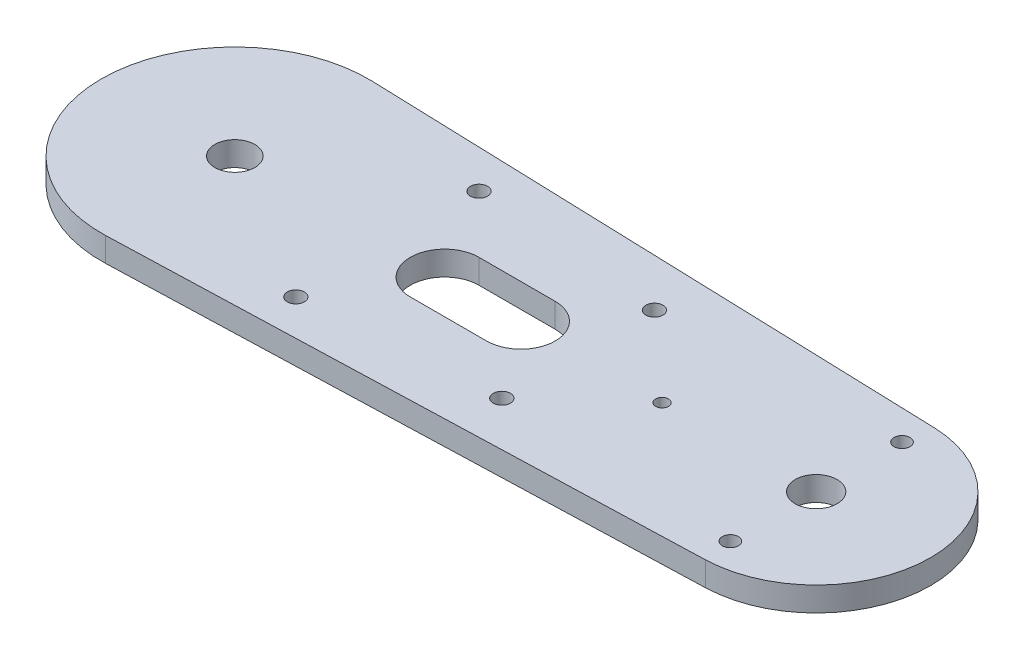
ISO-10303-21;
HEADER;
FILE_DESCRIPTION(('STEP AP214'),'2;1');
FILE_NAME('part.step','',(''),(''),'','','');
FILE_SCHEMA(('AUTOMOTIVE_DESIGN { 1 0 10303 214 1 1 1 1 }'));
ENDSEC;
DATA;
#1=APPLICATION_CONTEXT('core data for automotive mechanical design processes');
#2=APPLICATION_PROTOCOL_DEFINITION('international standard','automotive_design',2000,#1);
#3=PRODUCT_CONTEXT('',#1,'mechanical');
#4=PRODUCT('Part','Part','',(#3));
#5=PRODUCT_RELATED_PRODUCT_CATEGORY('part','',(#4));
#6=PRODUCT_DEFINITION_FORMATION('','',#4);
#7=PRODUCT_DEFINITION_CONTEXT('part definition',#1,'design');
#8=PRODUCT_DEFINITION('design','',#6,#7);
#9=PRODUCT_DEFINITION_SHAPE('','',#8);
#10=(LENGTH_UNIT() NAMED_UNIT(*) SI_UNIT(.MILLI.,.METRE.));
#11=(NAMED_UNIT(*) PLANE_ANGLE_UNIT() SI_UNIT($,.RADIAN.));
#12=(NAMED_UNIT(*) SI_UNIT($,.STERADIAN.) SOLID_ANGLE_UNIT());
#13=UNCERTAINTY_MEASURE_WITH_UNIT(LENGTH_MEASURE(1.E-05),#10,'distance_accuracy_value','');
#14=(GEOMETRIC_REPRESENTATION_CONTEXT(3) GLOBAL_UNCERTAINTY_ASSIGNED_CONTEXT((#13)) GLOBAL_UNIT_ASSIGNED_CONTEXT((#10,
#11,#12)) REPRESENTATION_CONTEXT('',''));
#15=CARTESIAN_POINT('',(0.,0.,0.));
#16=DIRECTION('',(0.,0.,1.));
#17=DIRECTION('',(1.,0.,0.));
#18=AXIS2_PLACEMENT_3D('',#15,#16,#17);
#19=CARTESIAN_POINT('',(0.,-4.,0.));
#20=DIRECTION('',(0.,1.,0.));
#21=DIRECTION('',(0.,0.,1.));
#22=AXIS2_PLACEMENT_3D('',#19,#20,#21);
#23=PLANE('',#22);
#24=CARTESIAN_POINT('',(112.,-4.,171.45));
#25=DIRECTION('',(0.,1.,0.));
#26=DIRECTION('',(0.,0.,1.));
#27=AXIS2_PLACEMENT_3D('',#24,#25,#26);
#28=CIRCLE('',#27,1.69999999999999);
#29=CARTESIAN_POINT('',(112.,-4.,173.15));
#30=VERTEX_POINT('',#29);
#31=EDGE_CURVE('E380',#30,#30,#28,.T.);
#32=ORIENTED_EDGE('',*,*,#31,.F.);
#33=EDGE_LOOP('',(#32));
#34=FACE_BOUND('',#33,.T.);
#35=CARTESIAN_POINT('',(0.,-4.,171.45));
#36=DIRECTION('',(0.,1.,0.));
#37=DIRECTION('',(0.,0.,1.));
#38=AXIS2_PLACEMENT_3D('',#35,#36,#37);
#39=CIRCLE('',#38,5.25);
#40=CARTESIAN_POINT('',(0.,-4.,176.7));
#41=VERTEX_POINT('',#40);
#42=EDGE_CURVE('E383',#41,#41,#39,.T.);
#43=ORIENTED_EDGE('',*,*,#42,.F.);
#44=EDGE_LOOP('',(#43));
#45=FACE_BOUND('',#44,.T.);
#46=CARTESIAN_POINT('',(152.4,-4.,171.45));
#47=DIRECTION('',(0.,1.,0.));
#48=DIRECTION('',(0.,0.,1.));
#49=AXIS2_PLACEMENT_3D('',#46,#47,#48);
#50=CIRCLE('',#49,5.50000000000001);
#51=CARTESIAN_POINT('',(152.4,-4.,176.95));
#52=VERTEX_POINT('',#51);
#53=EDGE_CURVE('E395',#52,#52,#50,.T.);
#54=ORIENTED_EDGE('',*,*,#53,.F.);
#55=EDGE_LOOP('',(#54));
#56=FACE_BOUND('',#55,.T.);
#57=CARTESIAN_POINT('',(152.4,-4.,193.95));
#58=DIRECTION('',(0.,1.,0.));
#59=DIRECTION('',(0.,0.,1.));
#60=AXIS2_PLACEMENT_3D('',#57,#58,#59);
#61=CIRCLE('',#60,2.09999999999999);
#62=CARTESIAN_POINT('',(152.4,-4.,196.05));
#63=VERTEX_POINT('',#62);
#64=EDGE_CURVE('E402',#63,#63,#61,.T.);
#65=ORIENTED_EDGE('',*,*,#64,.F.);
#66=EDGE_LOOP('',(#65));
#67=FACE_BOUND('',#66,.T.);
#68=CARTESIAN_POINT('',(152.4,-4.,148.95));
#69=DIRECTION('',(0.,1.,0.));
#70=DIRECTION('',(0.,0.,1.));
#71=AXIS2_PLACEMENT_3D('',#68,#69,#70);
#72=CIRCLE('',#71,2.09999999999999);
#73=CARTESIAN_POINT('',(152.4,-4.,151.05));
#74=VERTEX_POINT('',#73);
#75=EDGE_CURVE('E385',#74,#74,#72,.T.);
#76=ORIENTED_EDGE('',*,*,#75,.F.);
#77=EDGE_LOOP('',(#76));
#78=FACE_BOUND('',#77,.T.);
#79=CARTESIAN_POINT('',(40.,-4.,147.45));
#80=DIRECTION('',(0.,1.,0.));
#81=DIRECTION('',(0.,0.,1.));
#82=AXIS2_PLACEMENT_3D('',#79,#80,#81);
#83=CIRCLE('',#82,2.25);
#84=CARTESIAN_POINT('',(40.,-4.,149.7));
#85=VERTEX_POINT('',#84);
#86=EDGE_CURVE('E416',#85,#85,#83,.T.);
#87=ORIENTED_EDGE('',*,*,#86,.F.);
#88=EDGE_LOOP('',(#87));
#89=FACE_BOUND('',#88,.T.);
#90=CARTESIAN_POINT('',(90.,-4.,191.45));
#91=DIRECTION('',(0.,1.,0.));
#92=DIRECTION('',(0.,0.,1.));
#93=AXIS2_PLACEMENT_3D('',#90,#91,#92);
#94=CIRCLE('',#93,2.25);
#95=CARTESIAN_POINT('',(90.,-4.,193.7));
#96=VERTEX_POINT('',#95);
#97=EDGE_CURVE('E412',#96,#96,#94,.T.);
#98=ORIENTED_EDGE('',*,*,#97,.F.);
#99=EDGE_LOOP('',(#98));
#100=FACE_BOUND('',#99,.T.);
#101=CARTESIAN_POINT('',(90.,-4.,151.45));
#102=DIRECTION('',(0.,1.,0.));
#103=DIRECTION('',(0.,0.,1.));
#104=AXIS2_PLACEMENT_3D('',#101,#102,#103);
#105=CIRCLE('',#104,2.25);
#106=CARTESIAN_POINT('',(90.,-4.,153.7));
#107=VERTEX_POINT('',#106);
#108=EDGE_CURVE('E387',#107,#107,#105,.T.);
#109=ORIENTED_EDGE('',*,*,#108,.F.);
#110=EDGE_LOOP('',(#109));
#111=FACE_BOUND('',#110,.T.);
#112=CARTESIAN_POINT('',(40.,-4.,195.45));
#113=DIRECTION('',(0.,1.,0.));
#114=DIRECTION('',(0.,0.,1.));
#115=AXIS2_PLACEMENT_3D('',#112,#113,#114);
#116=CIRCLE('',#115,2.25);
#117=CARTESIAN_POINT('',(40.,-4.,197.7));
#118=VERTEX_POINT('',#117);
#119=EDGE_CURVE('E137',#118,#118,#116,.T.);
#120=ORIENTED_EDGE('',*,*,#119,.F.);
#121=EDGE_LOOP('',(#120));
#122=FACE_BOUND('',#121,.T.);
#123=DIRECTION('',(0.999461659573957,0.,-0.0328083989501311));
#124=VECTOR('',#123,1.);
#125=CARTESIAN_POINT('',(1.14829396325459,-4.,206.431158085088));
#126=LINE('',#125,#124);
#127=CARTESIAN_POINT('',(1.14829396325459,-4.,206.431158085088));
#128=VERTEX_POINT('',#127);
#129=CARTESIAN_POINT('',(153.384251968504,-4.,201.433849787219));
#130=VERTEX_POINT('',#129);
#131=EDGE_CURVE('E159',#128,#130,#126,.T.);
#132=ORIENTED_EDGE('',*,*,#131,.T.);
#133=CARTESIAN_POINT('',(152.4,-4.,171.45));
#134=DIRECTION('',(0.,1.,0.));
#135=DIRECTION('',(0.,0.,1.));
#136=AXIS2_PLACEMENT_3D('',#133,#134,#135);
#137=CIRCLE('',#136,30.);
#138=CARTESIAN_POINT('',(153.384251968504,-4.,141.466150212781));
#139=VERTEX_POINT('',#138);
#140=EDGE_CURVE('E146',#130,#139,#137,.T.);
#141=ORIENTED_EDGE('',*,*,#140,.T.);
#142=DIRECTION('',(-0.999461659573957,0.,-0.0328083989501311));
#143=VECTOR('',#142,1.);
#144=CARTESIAN_POINT('',(153.384251968504,-4.,141.466150212781));
#145=LINE('',#144,#143);
#146=CARTESIAN_POINT('',(1.14829396325459,-4.,136.468841914911));
#147=VERTEX_POINT('',#146);
#148=EDGE_CURVE('E158',#139,#147,#145,.T.);
#149=ORIENTED_EDGE('',*,*,#148,.T.);
#150=CARTESIAN_POINT('',(0.,-4.,171.45));
#151=DIRECTION('',(0.,1.,0.));
#152=DIRECTION('',(0.,0.,1.));
#153=AXIS2_PLACEMENT_3D('',#150,#151,#152);
#154=CIRCLE('',#153,35.);
#155=EDGE_CURVE('E151',#147,#128,#154,.T.);
#156=ORIENTED_EDGE('',*,*,#155,.T.);
#157=EDGE_LOOP('',(#132,#141,#149,#156));
#158=FACE_BOUND('',#157,.T.);
#159=DIRECTION('',(1.,0.,0.));
#160=VECTOR('',#159,1.);
#161=CARTESIAN_POINT('',(75.,-4.,180.45));
#162=LINE('',#161,#160);
#163=CARTESIAN_POINT('',(55.,-4.,180.45));
#164=VERTEX_POINT('',#163);
#165=CARTESIAN_POINT('',(75.,-4.,180.45));
#166=VERTEX_POINT('',#165);
#167=EDGE_CURVE('E116',#164,#166,#162,.T.);
#168=ORIENTED_EDGE('',*,*,#167,.F.);
#169=CARTESIAN_POINT('',(55.,-4.,171.45));
#170=DIRECTION('',(0.,1.,0.));
#171=DIRECTION('',(0.,0.,-1.));
#172=AXIS2_PLACEMENT_3D('',#169,#170,#171);
#173=CIRCLE('',#172,9.00000000000001);
#174=CARTESIAN_POINT('',(55.,-4.,162.45));
#175=VERTEX_POINT('',#174);
#176=EDGE_CURVE('E108',#175,#164,#173,.T.);
#177=ORIENTED_EDGE('',*,*,#176,.F.);
#178=DIRECTION('',(-1.,0.,0.));
#179=VECTOR('',#178,1.);
#180=CARTESIAN_POINT('',(55.,-4.,162.45));
#181=LINE('',#180,#179);
#182=CARTESIAN_POINT('',(75.,-4.,162.45));
#183=VERTEX_POINT('',#182);
#184=EDGE_CURVE('E129',#183,#175,#181,.T.);
#185=ORIENTED_EDGE('',*,*,#184,.F.);
#186=CARTESIAN_POINT('',(75.,-4.,171.45));
#187=DIRECTION('',(0.,1.,0.));
#188=DIRECTION('',(0.,0.,-1.));
#189=AXIS2_PLACEMENT_3D('',#186,#187,#188);
#190=CIRCLE('',#189,9.00000000000001);
#191=EDGE_CURVE('E127',#166,#183,#190,.T.);
#192=ORIENTED_EDGE('',*,*,#191,.F.);
#193=EDGE_LOOP('',(#168,#177,#185,#192));
#194=FACE_BOUND('',#193,.T.);
#195=ADVANCED_FACE('F43',(#34,#45,#56,#67,#78,#89,#100,#111,#122,#158,#194),#23,.T.);
#196=CARTESIAN_POINT('',(0.,-10.35,0.));
#197=DIRECTION('',(0.,1.,0.));
#198=DIRECTION('',(0.,0.,1.));
#199=AXIS2_PLACEMENT_3D('',#196,#197,#198);
#200=PLANE('',#199);
#201=CARTESIAN_POINT('',(112.,-10.35,171.45));
#202=DIRECTION('',(0.,1.,0.));
#203=DIRECTION('',(0.,0.,1.));
#204=AXIS2_PLACEMENT_3D('',#201,#202,#203);
#205=CIRCLE('',#204,1.69999999999999);
#206=CARTESIAN_POINT('',(112.,-10.35,173.15));
#207=VERTEX_POINT('',#206);
#208=EDGE_CURVE('E379',#207,#207,#205,.T.);
#209=ORIENTED_EDGE('',*,*,#208,.T.);
#210=EDGE_LOOP('',(#209));
#211=FACE_BOUND('',#210,.T.);
#212=CARTESIAN_POINT('',(0.,-10.35,171.45));
#213=DIRECTION('',(0.,1.,0.));
#214=DIRECTION('',(0.,0.,1.));
#215=AXIS2_PLACEMENT_3D('',#212,#213,#214);
#216=CIRCLE('',#215,5.25);
#217=CARTESIAN_POINT('',(0.,-10.35,176.7));
#218=VERTEX_POINT('',#217);
#219=EDGE_CURVE('E388',#218,#218,#216,.T.);
#220=ORIENTED_EDGE('',*,*,#219,.T.);
#221=EDGE_LOOP('',(#220));
#222=FACE_BOUND('',#221,.T.);
#223=CARTESIAN_POINT('',(152.4,-10.35,171.45));
#224=DIRECTION('',(0.,1.,0.));
#225=DIRECTION('',(0.,0.,1.));
#226=AXIS2_PLACEMENT_3D('',#223,#224,#225);
#227=CIRCLE('',#226,5.50000000000001);
#228=CARTESIAN_POINT('',(152.4,-10.35,176.95));
#229=VERTEX_POINT('',#228);
#230=EDGE_CURVE('E392',#229,#229,#227,.T.);
#231=ORIENTED_EDGE('',*,*,#230,.T.);
#232=EDGE_LOOP('',(#231));
#233=FACE_BOUND('',#232,.T.);
#234=CARTESIAN_POINT('',(152.4,-10.35,193.95));
#235=DIRECTION('',(0.,1.,0.));
#236=DIRECTION('',(0.,0.,1.));
#237=AXIS2_PLACEMENT_3D('',#234,#235,#236);
#238=CIRCLE('',#237,2.09999999999999);
#239=CARTESIAN_POINT('',(152.4,-10.35,196.05));
#240=VERTEX_POINT('',#239);
#241=EDGE_CURVE('E400',#240,#240,#238,.T.);
#242=ORIENTED_EDGE('',*,*,#241,.T.);
#243=EDGE_LOOP('',(#242));
#244=FACE_BOUND('',#243,.T.);
#245=CARTESIAN_POINT('',(152.4,-10.35,148.95));
#246=DIRECTION('',(0.,1.,0.));
#247=DIRECTION('',(0.,0.,1.));
#248=AXIS2_PLACEMENT_3D('',#245,#246,#247);
#249=CIRCLE('',#248,2.09999999999999);
#250=CARTESIAN_POINT('',(152.4,-10.35,151.05));
#251=VERTEX_POINT('',#250);
#252=EDGE_CURVE('E404',#251,#251,#249,.T.);
#253=ORIENTED_EDGE('',*,*,#252,.T.);
#254=EDGE_LOOP('',(#253));
#255=FACE_BOUND('',#254,.T.);
#256=CARTESIAN_POINT('',(40.,-10.35,147.45));
#257=DIRECTION('',(0.,1.,0.));
#258=DIRECTION('',(0.,0.,1.));
#259=AXIS2_PLACEMENT_3D('',#256,#257,#258);
#260=CIRCLE('',#259,2.25);
#261=CARTESIAN_POINT('',(40.,-10.35,149.7));
#262=VERTEX_POINT('',#261);
#263=EDGE_CURVE('E415',#262,#262,#260,.T.);
#264=ORIENTED_EDGE('',*,*,#263,.T.);
#265=EDGE_LOOP('',(#264));
#266=FACE_BOUND('',#265,.T.);
#267=CARTESIAN_POINT('',(90.,-10.35,191.45));
#268=DIRECTION('',(0.,1.,0.));
#269=DIRECTION('',(0.,0.,1.));
#270=AXIS2_PLACEMENT_3D('',#267,#268,#269);
#271=CIRCLE('',#270,2.25);
#272=CARTESIAN_POINT('',(90.,-10.35,193.7));
#273=VERTEX_POINT('',#272);
#274=EDGE_CURVE('E422',#273,#273,#271,.T.);
#275=ORIENTED_EDGE('',*,*,#274,.T.);
#276=EDGE_LOOP('',(#275));
#277=FACE_BOUND('',#276,.T.);
#278=CARTESIAN_POINT('',(90.,-10.35,151.45));
#279=DIRECTION('',(0.,1.,0.));
#280=DIRECTION('',(0.,0.,1.));
#281=AXIS2_PLACEMENT_3D('',#278,#279,#280);
#282=CIRCLE('',#281,2.25);
#283=CARTESIAN_POINT('',(90.,-10.35,153.7));
#284=VERTEX_POINT('',#283);
#285=EDGE_CURVE('E408',#284,#284,#282,.T.);
#286=ORIENTED_EDGE('',*,*,#285,.T.);
#287=EDGE_LOOP('',(#286));
#288=FACE_BOUND('',#287,.T.);
#289=CARTESIAN_POINT('',(40.,-10.35,195.45));
#290=DIRECTION('',(0.,1.,0.));
#291=DIRECTION('',(0.,0.,1.));
#292=AXIS2_PLACEMENT_3D('',#289,#290,#291);
#293=CIRCLE('',#292,2.25);
#294=CARTESIAN_POINT('',(40.,-10.35,197.7));
#295=VERTEX_POINT('',#294);
#296=EDGE_CURVE('E420',#295,#295,#293,.T.);
#297=ORIENTED_EDGE('',*,*,#296,.T.);
#298=EDGE_LOOP('',(#297));
#299=FACE_BOUND('',#298,.T.);
#300=DIRECTION('',(-0.999461659573957,0.,-0.0328083989501311));
#301=VECTOR('',#300,1.);
#302=CARTESIAN_POINT('',(153.384251968504,-10.35,141.466150212781));
#303=LINE('',#302,#301);
#304=CARTESIAN_POINT('',(153.384251968504,-10.35,141.466150212781));
#305=VERTEX_POINT('',#304);
#306=CARTESIAN_POINT('',(1.14829396325459,-10.35,136.468841914911));
#307=VERTEX_POINT('',#306);
#308=EDGE_CURVE('E163',#305,#307,#303,.T.);
#309=ORIENTED_EDGE('',*,*,#308,.F.);
#310=CARTESIAN_POINT('',(152.4,-10.35,171.45));
#311=DIRECTION('',(0.,1.,0.));
#312=DIRECTION('',(0.,0.,1.));
#313=AXIS2_PLACEMENT_3D('',#310,#311,#312);
#314=CIRCLE('',#313,30.);
#315=CARTESIAN_POINT('',(153.384251968504,-10.35,201.433849787219));
#316=VERTEX_POINT('',#315);
#317=EDGE_CURVE('E121',#316,#305,#314,.T.);
#318=ORIENTED_EDGE('',*,*,#317,.F.);
#319=DIRECTION('',(0.999461659573957,0.,-0.0328083989501311));
#320=VECTOR('',#319,1.);
#321=CARTESIAN_POINT('',(1.14829396325459,-10.35,206.431158085088));
#322=LINE('',#321,#320);
#323=CARTESIAN_POINT('',(1.14829396325459,-10.35,206.431158085088));
#324=VERTEX_POINT('',#323);
#325=EDGE_CURVE('E153',#324,#316,#322,.T.);
#326=ORIENTED_EDGE('',*,*,#325,.F.);
#327=CARTESIAN_POINT('',(0.,-10.35,171.45));
#328=DIRECTION('',(0.,1.,0.));
#329=DIRECTION('',(0.,0.,1.));
#330=AXIS2_PLACEMENT_3D('',#327,#328,#329);
#331=CIRCLE('',#330,35.);
#332=EDGE_CURVE('E148',#307,#324,#331,.T.);
#333=ORIENTED_EDGE('',*,*,#332,.F.);
#334=EDGE_LOOP('',(#309,#318,#326,#333));
#335=FACE_BOUND('',#334,.T.);
#336=CARTESIAN_POINT('',(55.,-10.35,171.45));
#337=DIRECTION('',(0.,1.,0.));
#338=DIRECTION('',(0.,0.,-1.));
#339=AXIS2_PLACEMENT_3D('',#336,#337,#338);
#340=CIRCLE('',#339,9.00000000000001);
#341=CARTESIAN_POINT('',(55.,-10.35,162.45));
#342=VERTEX_POINT('',#341);
#343=CARTESIAN_POINT('',(55.,-10.35,180.45));
#344=VERTEX_POINT('',#343);
#345=EDGE_CURVE('E66',#342,#344,#340,.T.);
#346=ORIENTED_EDGE('',*,*,#345,.T.);
#347=DIRECTION('',(1.,0.,0.));
#348=VECTOR('',#347,1.);
#349=CARTESIAN_POINT('',(75.,-10.35,180.45));
#350=LINE('',#349,#348);
#351=CARTESIAN_POINT('',(75.,-10.35,180.45));
#352=VERTEX_POINT('',#351);
#353=EDGE_CURVE('E124',#344,#352,#350,.T.);
#354=ORIENTED_EDGE('',*,*,#353,.T.);
#355=CARTESIAN_POINT('',(75.,-10.35,171.45));
#356=DIRECTION('',(0.,1.,0.));
#357=DIRECTION('',(0.,0.,-1.));
#358=AXIS2_PLACEMENT_3D('',#355,#356,#357);
#359=CIRCLE('',#358,9.00000000000001);
#360=CARTESIAN_POINT('',(75.,-10.35,162.45));
#361=VERTEX_POINT('',#360);
#362=EDGE_CURVE('E140',#352,#361,#359,.T.);
#363=ORIENTED_EDGE('',*,*,#362,.T.);
#364=DIRECTION('',(-1.,0.,0.));
#365=VECTOR('',#364,1.);
#366=CARTESIAN_POINT('',(55.,-10.35,162.45));
#367=LINE('',#366,#365);
#368=EDGE_CURVE('E120',#361,#342,#367,.T.);
#369=ORIENTED_EDGE('',*,*,#368,.T.);
#370=EDGE_LOOP('',(#346,#354,#363,#369));
#371=FACE_BOUND('',#370,.T.);
#372=ADVANCED_FACE('F178',(#211,#222,#233,#244,#255,#266,#277,#288,#299,#335,#371),#200,.F.);
#373=CARTESIAN_POINT('',(1.14829396325459,-4.,206.431158085088));
#374=DIRECTION('',(-0.0328083989501311,0.,-0.999461659573957));
#375=DIRECTION('',(-0.999461659573957,0.,0.0328083989501311));
#376=AXIS2_PLACEMENT_3D('',#373,#374,#375);
#377=PLANE('',#376);
#378=ORIENTED_EDGE('',*,*,#325,.T.);
#379=DIRECTION('',(0.,-1.,0.));
#380=VECTOR('',#379,1.);
#381=CARTESIAN_POINT('',(153.384251968504,-4.,201.433849787219));
#382=LINE('',#381,#380);
#383=EDGE_CURVE('E51',#130,#316,#382,.T.);
#384=ORIENTED_EDGE('',*,*,#383,.F.);
#385=ORIENTED_EDGE('',*,*,#131,.F.);
#386=DIRECTION('',(0.,-1.,0.));
#387=VECTOR('',#386,1.);
#388=CARTESIAN_POINT('',(1.14829396325459,-4.,206.431158085088));
#389=LINE('',#388,#387);
#390=EDGE_CURVE('E11',#128,#324,#389,.T.);
#391=ORIENTED_EDGE('',*,*,#390,.T.);
#392=EDGE_LOOP('',(#378,#384,#385,#391));
#393=FACE_BOUND('',#392,.T.);
#394=ADVANCED_FACE('F44',(#393),#377,.F.);
#395=CARTESIAN_POINT('',(153.384251968504,-4.,141.466150212781));
#396=DIRECTION('',(-0.0328083989501311,0.,0.999461659573957));
#397=DIRECTION('',(0.999461659573957,0.,0.0328083989501311));
#398=AXIS2_PLACEMENT_3D('',#395,#396,#397);
#399=PLANE('',#398);
#400=ORIENTED_EDGE('',*,*,#308,.T.);
#401=DIRECTION('',(0.,-1.,0.));
#402=VECTOR('',#401,1.);
#403=CARTESIAN_POINT('',(1.14829396325459,-4.,136.468841914911));
#404=LINE('',#403,#402);
#405=EDGE_CURVE('E161',#147,#307,#404,.T.);
#406=ORIENTED_EDGE('',*,*,#405,.F.);
#407=ORIENTED_EDGE('',*,*,#148,.F.);
#408=DIRECTION('',(0.,-1.,0.));
#409=VECTOR('',#408,1.);
#410=CARTESIAN_POINT('',(153.384251968504,-4.,141.466150212781));
#411=LINE('',#410,#409);
#412=EDGE_CURVE('E169',#139,#305,#411,.T.);
#413=ORIENTED_EDGE('',*,*,#412,.T.);
#414=EDGE_LOOP('',(#400,#406,#407,#413));
#415=FACE_BOUND('',#414,.T.);
#416=ADVANCED_FACE('F189',(#415),#399,.F.);
#417=CARTESIAN_POINT('',(0.,-4.,171.45));
#418=DIRECTION('',(0.,-1.,0.));
#419=DIRECTION('',(0.,0.,-1.));
#420=AXIS2_PLACEMENT_3D('',#417,#418,#419);
#421=CYLINDRICAL_SURFACE('',#420,35.);
#422=ORIENTED_EDGE('',*,*,#332,.T.);
#423=ORIENTED_EDGE('',*,*,#390,.F.);
#424=ORIENTED_EDGE('',*,*,#155,.F.);
#425=ORIENTED_EDGE('',*,*,#405,.T.);
#426=EDGE_LOOP('',(#422,#423,#424,#425));
#427=FACE_BOUND('',#426,.T.);
#428=ADVANCED_FACE('F183',(#427),#421,.T.);
#429=CARTESIAN_POINT('',(152.4,-4.,171.45));
#430=DIRECTION('',(0.,-1.,0.));
#431=DIRECTION('',(0.,0.,-1.));
#432=AXIS2_PLACEMENT_3D('',#429,#430,#431);
#433=CYLINDRICAL_SURFACE('',#432,30.);
#434=ORIENTED_EDGE('',*,*,#140,.F.);
#435=ORIENTED_EDGE('',*,*,#383,.T.);
#436=ORIENTED_EDGE('',*,*,#317,.T.);
#437=ORIENTED_EDGE('',*,*,#412,.F.);
#438=EDGE_LOOP('',(#434,#435,#436,#437));
#439=FACE_BOUND('',#438,.T.);
#440=ADVANCED_FACE('F172',(#439),#433,.T.);
#441=CARTESIAN_POINT('',(55.,-4.,171.45));
#442=DIRECTION('',(0.,-1.,0.));
#443=DIRECTION('',(0.,0.,-1.));
#444=AXIS2_PLACEMENT_3D('',#441,#442,#443);
#445=CYLINDRICAL_SURFACE('',#444,9.00000000000001);
#446=ORIENTED_EDGE('',*,*,#345,.F.);
#447=DIRECTION('',(0.,-1.,0.));
#448=VECTOR('',#447,1.);
#449=CARTESIAN_POINT('',(55.,-4.,162.45));
#450=LINE('',#449,#448);
#451=EDGE_CURVE('E115',#175,#342,#450,.T.);
#452=ORIENTED_EDGE('',*,*,#451,.F.);
#453=ORIENTED_EDGE('',*,*,#176,.T.);
#454=DIRECTION('',(0.,-1.,0.));
#455=VECTOR('',#454,1.);
#456=CARTESIAN_POINT('',(55.,-4.,180.45));
#457=LINE('',#456,#455);
#458=EDGE_CURVE('E111',#164,#344,#457,.T.);
#459=ORIENTED_EDGE('',*,*,#458,.T.);
#460=EDGE_LOOP('',(#446,#452,#453,#459));
#461=FACE_BOUND('',#460,.T.);
#462=ADVANCED_FACE('F109',(#461),#445,.F.);
#463=CARTESIAN_POINT('',(75.,-4.,180.45));
#464=DIRECTION('',(0.,0.,-1.));
#465=DIRECTION('',(-1.,0.,0.));
#466=AXIS2_PLACEMENT_3D('',#463,#464,#465);
#467=PLANE('',#466);
#468=ORIENTED_EDGE('',*,*,#353,.F.);
#469=ORIENTED_EDGE('',*,*,#458,.F.);
#470=ORIENTED_EDGE('',*,*,#167,.T.);
#471=DIRECTION('',(0.,-1.,0.));
#472=VECTOR('',#471,1.);
#473=CARTESIAN_POINT('',(75.,-4.,180.45));
#474=LINE('',#473,#472);
#475=EDGE_CURVE('E123',#166,#352,#474,.T.);
#476=ORIENTED_EDGE('',*,*,#475,.T.);
#477=EDGE_LOOP('',(#468,#469,#470,#476));
#478=FACE_BOUND('',#477,.T.);
#479=ADVANCED_FACE('F119',(#478),#467,.T.);
#480=CARTESIAN_POINT('',(75.,-4.,171.45));
#481=DIRECTION('',(0.,-1.,0.));
#482=DIRECTION('',(0.,0.,-1.));
#483=AXIS2_PLACEMENT_3D('',#480,#481,#482);
#484=CYLINDRICAL_SURFACE('',#483,9.00000000000001);
#485=ORIENTED_EDGE('',*,*,#362,.F.);
#486=ORIENTED_EDGE('',*,*,#475,.F.);
#487=ORIENTED_EDGE('',*,*,#191,.T.);
#488=DIRECTION('',(0.,-1.,0.));
#489=VECTOR('',#488,1.);
#490=CARTESIAN_POINT('',(75.,-4.,162.45));
#491=LINE('',#490,#489);
#492=EDGE_CURVE('E59',#183,#361,#491,.T.);
#493=ORIENTED_EDGE('',*,*,#492,.T.);
#494=EDGE_LOOP('',(#485,#486,#487,#493));
#495=FACE_BOUND('',#494,.T.);
#496=ADVANCED_FACE('F263',(#495),#484,.F.);
#497=CARTESIAN_POINT('',(55.,-4.,162.45));
#498=DIRECTION('',(0.,0.,1.));
#499=DIRECTION('',(1.,0.,0.));
#500=AXIS2_PLACEMENT_3D('',#497,#498,#499);
#501=PLANE('',#500);
#502=ORIENTED_EDGE('',*,*,#368,.F.);
#503=ORIENTED_EDGE('',*,*,#492,.F.);
#504=ORIENTED_EDGE('',*,*,#184,.T.);
#505=ORIENTED_EDGE('',*,*,#451,.T.);
#506=EDGE_LOOP('',(#502,#503,#504,#505));
#507=FACE_BOUND('',#506,.T.);
#508=ADVANCED_FACE('F271',(#507),#501,.T.);
#509=CARTESIAN_POINT('',(40.,-4.,195.45));
#510=DIRECTION('',(0.,-1.,0.));
#511=DIRECTION('',(0.,0.,-1.));
#512=AXIS2_PLACEMENT_3D('',#509,#510,#511);
#513=CYLINDRICAL_SURFACE('',#512,2.25);
#514=ORIENTED_EDGE('',*,*,#119,.T.);
#515=EDGE_LOOP('',(#514));
#516=FACE_BOUND('',#515,.T.);
#517=ORIENTED_EDGE('',*,*,#296,.F.);
#518=EDGE_LOOP('',(#517));
#519=FACE_BOUND('',#518,.T.);
#520=ADVANCED_FACE('F284',(#516,#519),#513,.F.);
#521=CARTESIAN_POINT('',(90.,-4.,151.45));
#522=DIRECTION('',(0.,-1.,0.));
#523=DIRECTION('',(0.,0.,-1.));
#524=AXIS2_PLACEMENT_3D('',#521,#522,#523);
#525=CYLINDRICAL_SURFACE('',#524,2.25);
#526=ORIENTED_EDGE('',*,*,#108,.T.);
#527=EDGE_LOOP('',(#526));
#528=FACE_BOUND('',#527,.T.);
#529=ORIENTED_EDGE('',*,*,#285,.F.);
#530=EDGE_LOOP('',(#529));
#531=FACE_BOUND('',#530,.T.);
#532=ADVANCED_FACE('F292',(#528,#531),#525,.F.);
#533=CARTESIAN_POINT('',(90.,-4.,191.45));
#534=DIRECTION('',(0.,-1.,0.));
#535=DIRECTION('',(0.,0.,-1.));
#536=AXIS2_PLACEMENT_3D('',#533,#534,#535);
#537=CYLINDRICAL_SURFACE('',#536,2.25);
#538=ORIENTED_EDGE('',*,*,#97,.T.);
#539=EDGE_LOOP('',(#538));
#540=FACE_BOUND('',#539,.T.);
#541=ORIENTED_EDGE('',*,*,#274,.F.);
#542=EDGE_LOOP('',(#541));
#543=FACE_BOUND('',#542,.T.);
#544=ADVANCED_FACE('F305',(#540,#543),#537,.F.);
#545=CARTESIAN_POINT('',(40.,-4.,147.45));
#546=DIRECTION('',(0.,-1.,0.));
#547=DIRECTION('',(0.,0.,-1.));
#548=AXIS2_PLACEMENT_3D('',#545,#546,#547);
#549=CYLINDRICAL_SURFACE('',#548,2.25);
#550=ORIENTED_EDGE('',*,*,#86,.T.);
#551=EDGE_LOOP('',(#550));
#552=FACE_BOUND('',#551,.T.);
#553=ORIENTED_EDGE('',*,*,#263,.F.);
#554=EDGE_LOOP('',(#553));
#555=FACE_BOUND('',#554,.T.);
#556=ADVANCED_FACE('F315',(#552,#555),#549,.F.);
#557=CARTESIAN_POINT('',(152.4,-4.,148.95));
#558=DIRECTION('',(0.,-1.,0.));
#559=DIRECTION('',(0.,0.,-1.));
#560=AXIS2_PLACEMENT_3D('',#557,#558,#559);
#561=CYLINDRICAL_SURFACE('',#560,2.09999999999999);
#562=ORIENTED_EDGE('',*,*,#75,.T.);
#563=EDGE_LOOP('',(#562));
#564=FACE_BOUND('',#563,.T.);
#565=ORIENTED_EDGE('',*,*,#252,.F.);
#566=EDGE_LOOP('',(#565));
#567=FACE_BOUND('',#566,.T.);
#568=ADVANCED_FACE('F325',(#564,#567),#561,.F.);
#569=CARTESIAN_POINT('',(152.4,-4.,193.95));
#570=DIRECTION('',(0.,-1.,0.));
#571=DIRECTION('',(0.,0.,-1.));
#572=AXIS2_PLACEMENT_3D('',#569,#570,#571);
#573=CYLINDRICAL_SURFACE('',#572,2.09999999999999);
#574=ORIENTED_EDGE('',*,*,#64,.T.);
#575=EDGE_LOOP('',(#574));
#576=FACE_BOUND('',#575,.T.);
#577=ORIENTED_EDGE('',*,*,#241,.F.);
#578=EDGE_LOOP('',(#577));
#579=FACE_BOUND('',#578,.T.);
#580=ADVANCED_FACE('F334',(#576,#579),#573,.F.);
#581=CARTESIAN_POINT('',(152.4,-4.,171.45));
#582=DIRECTION('',(0.,-1.,0.));
#583=DIRECTION('',(0.,0.,-1.));
#584=AXIS2_PLACEMENT_3D('',#581,#582,#583);
#585=CYLINDRICAL_SURFACE('',#584,5.50000000000001);
#586=ORIENTED_EDGE('',*,*,#53,.T.);
#587=EDGE_LOOP('',(#586));
#588=FACE_BOUND('',#587,.T.);
#589=ORIENTED_EDGE('',*,*,#230,.F.);
#590=EDGE_LOOP('',(#589));
#591=FACE_BOUND('',#590,.T.);
#592=ADVANCED_FACE('F345',(#588,#591),#585,.F.);
#593=CARTESIAN_POINT('',(0.,-4.,171.45));
#594=DIRECTION('',(0.,-1.,0.));
#595=DIRECTION('',(0.,0.,-1.));
#596=AXIS2_PLACEMENT_3D('',#593,#594,#595);
#597=CYLINDRICAL_SURFACE('',#596,5.25);
#598=ORIENTED_EDGE('',*,*,#42,.T.);
#599=EDGE_LOOP('',(#598));
#600=FACE_BOUND('',#599,.T.);
#601=ORIENTED_EDGE('',*,*,#219,.F.);
#602=EDGE_LOOP('',(#601));
#603=FACE_BOUND('',#602,.T.);
#604=ADVANCED_FACE('F354',(#600,#603),#597,.F.);
#605=CARTESIAN_POINT('',(112.,-4.,171.45));
#606=DIRECTION('',(0.,-1.,0.));
#607=DIRECTION('',(0.,0.,-1.));
#608=AXIS2_PLACEMENT_3D('',#605,#606,#607);
#609=CYLINDRICAL_SURFACE('',#608,1.69999999999999);
#610=ORIENTED_EDGE('',*,*,#31,.T.);
#611=EDGE_LOOP('',(#610));
#612=FACE_BOUND('',#611,.T.);
#613=ORIENTED_EDGE('',*,*,#208,.F.);
#614=EDGE_LOOP('',(#613));
#615=FACE_BOUND('',#614,.T.);
#616=ADVANCED_FACE('F363',(#612,#615),#609,.F.);
#617=CLOSED_SHELL('',(#195,#372,#394,#416,#428,#440,#462,#479,#496,#508,#520,#532,#544,#556,
#568,#580,#592,#604,#616));
#618=MANIFOLD_SOLID_BREP('B2',#617);
#619=ADVANCED_BREP_SHAPE_REPRESENTATION('',(#18,#618),#14);
#620=SHAPE_DEFINITION_REPRESENTATION(#9,#619);
ENDSEC;
END-ISO-10303-21;
